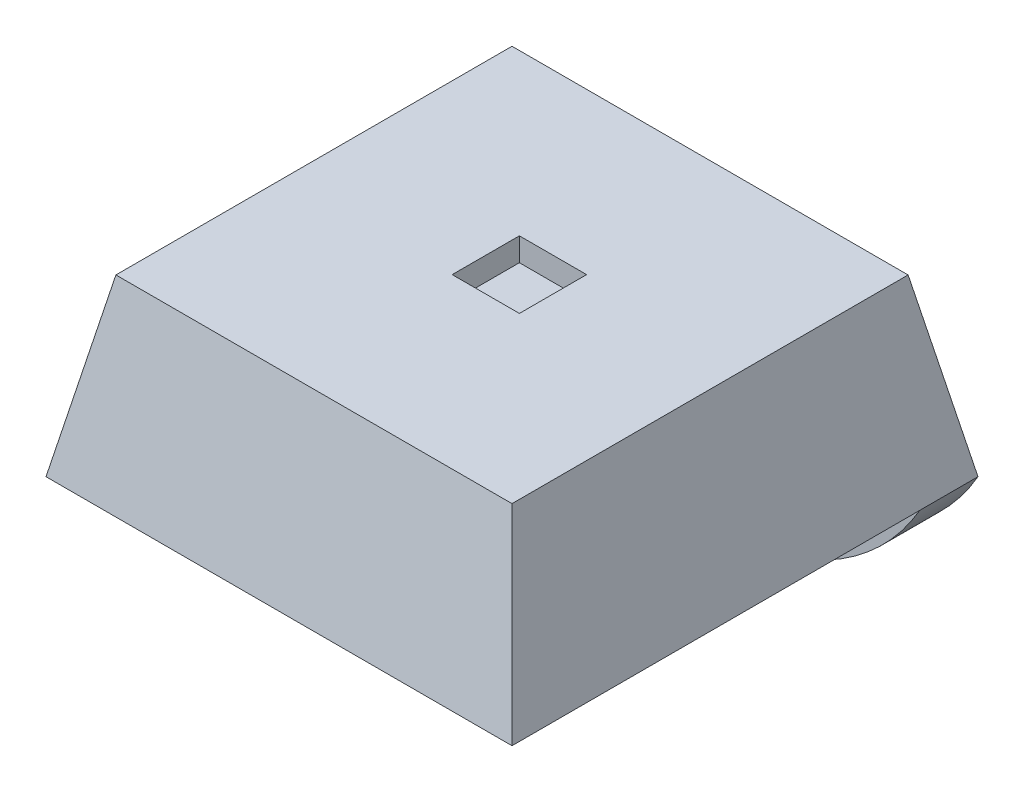
ISO-10303-21;
HEADER;
FILE_DESCRIPTION(('STEP AP214'),'2;1');
FILE_NAME('part.step','',(''),(''),'','','');
FILE_SCHEMA(('AUTOMOTIVE_DESIGN { 1 0 10303 214 1 1 1 1 }'));
ENDSEC;
DATA;
#1=APPLICATION_CONTEXT('core data for automotive mechanical design processes');
#2=APPLICATION_PROTOCOL_DEFINITION('international standard','automotive_design',2000,#1);
#3=PRODUCT_CONTEXT('',#1,'mechanical');
#4=PRODUCT('Part','Part','',(#3));
#5=PRODUCT_RELATED_PRODUCT_CATEGORY('part','',(#4));
#6=PRODUCT_DEFINITION_FORMATION('','',#4);
#7=PRODUCT_DEFINITION_CONTEXT('part definition',#1,'design');
#8=PRODUCT_DEFINITION('design','',#6,#7);
#9=PRODUCT_DEFINITION_SHAPE('','',#8);
#10=(LENGTH_UNIT() NAMED_UNIT(*) SI_UNIT(.MILLI.,.METRE.));
#11=(NAMED_UNIT(*) PLANE_ANGLE_UNIT() SI_UNIT($,.RADIAN.));
#12=(NAMED_UNIT(*) SI_UNIT($,.STERADIAN.) SOLID_ANGLE_UNIT());
#13=UNCERTAINTY_MEASURE_WITH_UNIT(LENGTH_MEASURE(1.E-05),#10,'distance_accuracy_value','');
#14=(GEOMETRIC_REPRESENTATION_CONTEXT(3) GLOBAL_UNCERTAINTY_ASSIGNED_CONTEXT((#13)) GLOBAL_UNIT_ASSIGNED_CONTEXT((#10,
#11,#12)) REPRESENTATION_CONTEXT('',''));
#15=CARTESIAN_POINT('',(0.,0.,0.));
#16=DIRECTION('',(0.,0.,1.));
#17=DIRECTION('',(1.,0.,0.));
#18=AXIS2_PLACEMENT_3D('',#15,#16,#17);
#19=CARTESIAN_POINT('',(0.,3.,0.));
#20=DIRECTION('',(0.,-1.,0.));
#21=DIRECTION('',(0.,0.,-1.));
#22=AXIS2_PLACEMENT_3D('',#19,#20,#21);
#23=PLANE('',#22);
#24=DIRECTION('',(-1.,0.,0.));
#25=VECTOR('',#24,1.);
#26=CARTESIAN_POINT('',(11.,3.,-0.6));
#27=LINE('',#26,#25);
#28=CARTESIAN_POINT('',(7.4,3.,-0.6));
#29=VERTEX_POINT('',#28);
#30=CARTESIAN_POINT('',(0.6,3.,-0.6));
#31=VERTEX_POINT('',#30);
#32=EDGE_CURVE('E181',#29,#31,#27,.T.);
#33=ORIENTED_EDGE('',*,*,#32,.F.);
#34=DIRECTION('',(0.,0.,1.));
#35=VECTOR('',#34,1.);
#36=CARTESIAN_POINT('',(7.4,3.,-8.));
#37=LINE('',#36,#35);
#38=CARTESIAN_POINT('',(7.4,3.,-7.4));
#39=VERTEX_POINT('',#38);
#40=EDGE_CURVE('E194',#39,#29,#37,.T.);
#41=ORIENTED_EDGE('',*,*,#40,.F.);
#42=DIRECTION('',(-1.,0.,0.));
#43=VECTOR('',#42,1.);
#44=CARTESIAN_POINT('',(11.,3.,-7.4));
#45=LINE('',#44,#43);
#46=CARTESIAN_POINT('',(0.599999999999999,3.,-7.4));
#47=VERTEX_POINT('',#46);
#48=EDGE_CURVE('E177',#39,#47,#45,.T.);
#49=ORIENTED_EDGE('',*,*,#48,.T.);
#50=DIRECTION('',(0.,0.,1.));
#51=VECTOR('',#50,1.);
#52=CARTESIAN_POINT('',(0.6,3.,-8.));
#53=LINE('',#52,#51);
#54=EDGE_CURVE('E197',#47,#31,#53,.T.);
#55=ORIENTED_EDGE('',*,*,#54,.T.);
#56=EDGE_LOOP('',(#33,#41,#49,#55));
#57=FACE_BOUND('',#56,.T.);
#58=DIRECTION('',(-1.,0.,0.));
#59=VECTOR('',#58,1.);
#60=CARTESIAN_POINT('',(4.63573241470774,3.,-3.49105487143866));
#61=LINE('',#60,#59);
#62=CARTESIAN_POINT('',(4.63573241470774,3.,-3.49105487143866));
#63=VERTEX_POINT('',#62);
#64=CARTESIAN_POINT('',(3.48188626086159,3.,-3.49105487143866));
#65=VERTEX_POINT('',#64);
#66=EDGE_CURVE('E59',#63,#65,#61,.T.);
#67=ORIENTED_EDGE('',*,*,#66,.T.);
#68=DIRECTION('',(0.,0.,-1.));
#69=VECTOR('',#68,1.);
#70=CARTESIAN_POINT('',(3.48188626086159,3.,-3.49105487143866));
#71=LINE('',#70,#69);
#72=CARTESIAN_POINT('',(3.48188626086159,3.,-4.64490102528481));
#73=VERTEX_POINT('',#72);
#74=EDGE_CURVE('E149',#65,#73,#71,.T.);
#75=ORIENTED_EDGE('',*,*,#74,.T.);
#76=DIRECTION('',(1.,0.,0.));
#77=VECTOR('',#76,1.);
#78=CARTESIAN_POINT('',(3.48188626086159,3.,-4.64490102528481));
#79=LINE('',#78,#77);
#80=CARTESIAN_POINT('',(4.63573241470774,3.,-4.64490102528481));
#81=VERTEX_POINT('',#80);
#82=EDGE_CURVE('E476',#73,#81,#79,.T.);
#83=ORIENTED_EDGE('',*,*,#82,.T.);
#84=DIRECTION('',(0.,0.,1.));
#85=VECTOR('',#84,1.);
#86=CARTESIAN_POINT('',(4.63573241470774,3.,-4.64490102528481));
#87=LINE('',#86,#85);
#88=EDGE_CURVE('E145',#81,#63,#87,.T.);
#89=ORIENTED_EDGE('',*,*,#88,.T.);
#90=EDGE_LOOP('',(#67,#75,#83,#89));
#91=FACE_BOUND('',#90,.T.);
#92=ADVANCED_FACE('F43',(#57,#91),#23,.F.);
#93=CARTESIAN_POINT('',(8.,0.,-8.));
#94=DIRECTION('',(-0.98058067569092,-0.196116135138184,0.));
#95=DIRECTION('',(0.196116135138184,-0.98058067569092,0.));
#96=AXIS2_PLACEMENT_3D('',#93,#94,#95);
#97=PLANE('',#96);
#98=DIRECTION('',(-0.192450089729875,0.962250448649376,-0.192450089729875));
#99=VECTOR('',#98,1.);
#100=CARTESIAN_POINT('',(7.7037037037037,1.48148148148148,-0.296296296296296));
#101=LINE('',#100,#99);
#102=CARTESIAN_POINT('',(8.,0.,0.));
#103=VERTEX_POINT('',#102);
#104=EDGE_CURVE('E191',#103,#29,#101,.T.);
#105=ORIENTED_EDGE('',*,*,#104,.F.);
#106=DIRECTION('',(0.,0.,-1.));
#107=VECTOR('',#106,1.);
#108=CARTESIAN_POINT('',(8.,0.,0.));
#109=LINE('',#108,#107);
#110=CARTESIAN_POINT('',(8.,0.,-7.));
#111=VERTEX_POINT('',#110);
#112=EDGE_CURVE('E210',#103,#111,#109,.T.);
#113=ORIENTED_EDGE('',*,*,#112,.T.);
#114=DIRECTION('',(0.,0.,1.));
#115=VECTOR('',#114,1.);
#116=CARTESIAN_POINT('',(8.,0.,-8.));
#117=LINE('',#116,#115);
#118=CARTESIAN_POINT('',(8.,0.,-8.));
#119=VERTEX_POINT('',#118);
#120=EDGE_CURVE('E151',#119,#111,#117,.T.);
#121=ORIENTED_EDGE('',*,*,#120,.F.);
#122=DIRECTION('',(0.192450089729875,-0.962250448649376,-0.192450089729875));
#123=VECTOR('',#122,1.);
#124=CARTESIAN_POINT('',(8.,0.,-8.));
#125=LINE('',#124,#123);
#126=EDGE_CURVE('E184',#39,#119,#125,.T.);
#127=ORIENTED_EDGE('',*,*,#126,.F.);
#128=ORIENTED_EDGE('',*,*,#40,.T.);
#129=EDGE_LOOP('',(#105,#113,#121,#127,#128));
#130=FACE_BOUND('',#129,.T.);
#131=ADVANCED_FACE('F278',(#130),#97,.F.);
#132=CARTESIAN_POINT('',(0.,0.,-8.));
#133=DIRECTION('',(0.98058067569092,-0.196116135138184,0.));
#134=DIRECTION('',(0.196116135138184,0.98058067569092,0.));
#135=AXIS2_PLACEMENT_3D('',#132,#133,#134);
#136=PLANE('',#135);
#137=DIRECTION('',(-0.192450089729875,-0.962250448649376,0.192450089729875));
#138=VECTOR('',#137,1.);
#139=CARTESIAN_POINT('',(0.296296296296296,1.48148148148148,-0.296296296296296));
#140=LINE('',#139,#138);
#141=CARTESIAN_POINT('',(0.,0.,0.));
#142=VERTEX_POINT('',#141);
#143=EDGE_CURVE('E238',#31,#142,#140,.T.);
#144=ORIENTED_EDGE('',*,*,#143,.F.);
#145=ORIENTED_EDGE('',*,*,#54,.F.);
#146=DIRECTION('',(0.192450089729875,0.962250448649376,0.192450089729875));
#147=VECTOR('',#146,1.);
#148=CARTESIAN_POINT('',(0.,0.,-8.));
#149=LINE('',#148,#147);
#150=CARTESIAN_POINT('',(0.,0.,-8.));
#151=VERTEX_POINT('',#150);
#152=EDGE_CURVE('E209',#151,#47,#149,.T.);
#153=ORIENTED_EDGE('',*,*,#152,.F.);
#154=DIRECTION('',(0.,0.,1.));
#155=VECTOR('',#154,1.);
#156=CARTESIAN_POINT('',(0.,0.,0.));
#157=LINE('',#156,#155);
#158=CARTESIAN_POINT('',(0.,0.,-7.));
#159=VERTEX_POINT('',#158);
#160=EDGE_CURVE('E214',#151,#159,#157,.T.);
#161=ORIENTED_EDGE('',*,*,#160,.T.);
#162=EDGE_CURVE('E201',#159,#142,#157,.T.);
#163=ORIENTED_EDGE('',*,*,#162,.T.);
#164=EDGE_LOOP('',(#144,#145,#153,#161,#163));
#165=FACE_BOUND('',#164,.T.);
#166=ADVANCED_FACE('F262',(#165),#136,.F.);
#167=CARTESIAN_POINT('',(0.,0.,0.));
#168=DIRECTION('',(0.,-1.,0.));
#169=DIRECTION('',(0.,0.,-1.));
#170=AXIS2_PLACEMENT_3D('',#167,#168,#169);
#171=PLANE('',#170);
#172=DIRECTION('',(-1.,0.,0.));
#173=VECTOR('',#172,1.);
#174=CARTESIAN_POINT('',(0.,0.,-7.));
#175=LINE('',#174,#173);
#176=EDGE_CURVE('E157',#111,#159,#175,.T.);
#177=ORIENTED_EDGE('',*,*,#176,.F.);
#178=ORIENTED_EDGE('',*,*,#112,.F.);
#179=DIRECTION('',(1.,0.,0.));
#180=VECTOR('',#179,1.);
#181=CARTESIAN_POINT('',(0.,0.,0.));
#182=LINE('',#181,#180);
#183=EDGE_CURVE('E211',#142,#103,#182,.T.);
#184=ORIENTED_EDGE('',*,*,#183,.F.);
#185=ORIENTED_EDGE('',*,*,#162,.F.);
#186=EDGE_LOOP('',(#177,#178,#184,#185));
#187=FACE_BOUND('',#186,.T.);
#188=CARTESIAN_POINT('',(4.,0.,-3.75));
#189=DIRECTION('',(0.,-1.,0.));
#190=DIRECTION('',(0.,0.,-1.));
#191=AXIS2_PLACEMENT_3D('',#188,#189,#190);
#192=CIRCLE('',#191,1.75);
#193=CARTESIAN_POINT('',(4.,0.,-5.5));
#194=VERTEX_POINT('',#193);
#195=EDGE_CURVE('E169',#194,#194,#192,.T.);
#196=ORIENTED_EDGE('',*,*,#195,.F.);
#197=EDGE_LOOP('',(#196));
#198=FACE_BOUND('',#197,.T.);
#199=ADVANCED_FACE('F273',(#187,#198),#171,.T.);
#200=CARTESIAN_POINT('',(11.,3.,-7.4));
#201=DIRECTION('',(0.,0.196116135138184,-0.98058067569092));
#202=DIRECTION('',(0.,0.98058067569092,0.196116135138184));
#203=AXIS2_PLACEMENT_3D('',#200,#201,#202);
#204=PLANE('',#203);
#205=ORIENTED_EDGE('',*,*,#126,.T.);
#206=DIRECTION('',(-1.,0.,0.));
#207=VECTOR('',#206,1.);
#208=CARTESIAN_POINT('',(0.,0.,-8.));
#209=LINE('',#208,#207);
#210=EDGE_CURVE('E205',#119,#151,#209,.T.);
#211=ORIENTED_EDGE('',*,*,#210,.T.);
#212=ORIENTED_EDGE('',*,*,#152,.T.);
#213=ORIENTED_EDGE('',*,*,#48,.F.);
#214=EDGE_LOOP('',(#205,#211,#212,#213));
#215=FACE_BOUND('',#214,.T.);
#216=ADVANCED_FACE('F257',(#215),#204,.T.);
#217=CARTESIAN_POINT('',(11.,0.,0.));
#218=DIRECTION('',(0.,0.196116135138184,0.98058067569092));
#219=DIRECTION('',(0.,-0.98058067569092,0.196116135138184));
#220=AXIS2_PLACEMENT_3D('',#217,#218,#219);
#221=PLANE('',#220);
#222=ORIENTED_EDGE('',*,*,#104,.T.);
#223=ORIENTED_EDGE('',*,*,#32,.T.);
#224=ORIENTED_EDGE('',*,*,#143,.T.);
#225=ORIENTED_EDGE('',*,*,#183,.T.);
#226=EDGE_LOOP('',(#222,#223,#224,#225));
#227=FACE_BOUND('',#226,.T.);
#228=ADVANCED_FACE('F302',(#227),#221,.T.);
#229=CARTESIAN_POINT('',(4.,0.4,-3.75));
#230=DIRECTION('',(0.,-1.,0.));
#231=DIRECTION('',(0.,0.,-1.));
#232=AXIS2_PLACEMENT_3D('',#229,#230,#231);
#233=CYLINDRICAL_SURFACE('',#232,1.75);
#234=CARTESIAN_POINT('',(4.,0.4,-3.75));
#235=DIRECTION('',(0.,-1.,0.));
#236=DIRECTION('',(0.,0.,-1.));
#237=AXIS2_PLACEMENT_3D('',#234,#235,#236);
#238=CIRCLE('',#237,1.75);
#239=CARTESIAN_POINT('',(4.,0.4,-5.5));
#240=VERTEX_POINT('',#239);
#241=EDGE_CURVE('E173',#240,#240,#238,.T.);
#242=ORIENTED_EDGE('',*,*,#241,.F.);
#243=EDGE_LOOP('',(#242));
#244=FACE_BOUND('',#243,.T.);
#245=ORIENTED_EDGE('',*,*,#195,.T.);
#246=EDGE_LOOP('',(#245));
#247=FACE_BOUND('',#246,.T.);
#248=ADVANCED_FACE('F309',(#244,#247),#233,.F.);
#249=CARTESIAN_POINT('',(4.,0.4,-3.75));
#250=DIRECTION('',(0.,-1.,0.));
#251=DIRECTION('',(0.,0.,-1.));
#252=AXIS2_PLACEMENT_3D('',#249,#250,#251);
#253=PLANE('',#252);
#254=ORIENTED_EDGE('',*,*,#241,.T.);
#255=EDGE_LOOP('',(#254));
#256=FACE_BOUND('',#255,.T.);
#257=ADVANCED_FACE('F313',(#256),#253,.T.);
#258=CARTESIAN_POINT('',(0.,-2.,-8.));
#259=DIRECTION('',(0.,0.,1.));
#260=DIRECTION('',(1.,0.,0.));
#261=AXIS2_PLACEMENT_3D('',#258,#259,#260);
#262=PLANE('',#261);
#263=ORIENTED_EDGE('',*,*,#210,.F.);
#264=CARTESIAN_POINT('',(4.53589838486225,2.,-8.));
#265=DIRECTION('',(0.,0.,1.));
#266=DIRECTION('',(1.,0.,0.));
#267=AXIS2_PLACEMENT_3D('',#264,#265,#266);
#268=CIRCLE('',#267,4.);
#269=CARTESIAN_POINT('',(4.53589838486225,-2.,-8.));
#270=VERTEX_POINT('',#269);
#271=EDGE_CURVE('E11',#119,#270,#268,.F.);
#272=ORIENTED_EDGE('',*,*,#271,.T.);
#273=DIRECTION('',(1.,0.,0.));
#274=VECTOR('',#273,1.);
#275=CARTESIAN_POINT('',(0.,-2.,-8.));
#276=LINE('',#275,#274);
#277=CARTESIAN_POINT('',(3.46410161513775,-2.,-8.));
#278=VERTEX_POINT('',#277);
#279=EDGE_CURVE('E163',#278,#270,#276,.T.);
#280=ORIENTED_EDGE('',*,*,#279,.F.);
#281=CARTESIAN_POINT('',(3.46410161513775,2.,-8.));
#282=DIRECTION('',(0.,0.,1.));
#283=DIRECTION('',(1.,0.,0.));
#284=AXIS2_PLACEMENT_3D('',#281,#282,#283);
#285=CIRCLE('',#284,4.);
#286=EDGE_CURVE('E52',#278,#151,#285,.F.);
#287=ORIENTED_EDGE('',*,*,#286,.T.);
#288=EDGE_LOOP('',(#263,#272,#280,#287));
#289=FACE_BOUND('',#288,.T.);
#290=ADVANCED_FACE('F250',(#289),#262,.F.);
#291=CARTESIAN_POINT('',(0.,-2.,-7.));
#292=DIRECTION('',(0.,0.,-1.));
#293=DIRECTION('',(-1.,0.,0.));
#294=AXIS2_PLACEMENT_3D('',#291,#292,#293);
#295=PLANE('',#294);
#296=DIRECTION('',(-1.,0.,0.));
#297=VECTOR('',#296,1.);
#298=CARTESIAN_POINT('',(0.,-2.,-7.));
#299=LINE('',#298,#297);
#300=CARTESIAN_POINT('',(4.53589838486225,-2.,-7.));
#301=VERTEX_POINT('',#300);
#302=CARTESIAN_POINT('',(3.46410161513775,-2.,-7.));
#303=VERTEX_POINT('',#302);
#304=EDGE_CURVE('E167',#301,#303,#299,.T.);
#305=ORIENTED_EDGE('',*,*,#304,.F.);
#306=CARTESIAN_POINT('',(4.53589838486225,2.,-7.));
#307=DIRECTION('',(0.,0.,-1.));
#308=DIRECTION('',(-1.,0.,0.));
#309=AXIS2_PLACEMENT_3D('',#306,#307,#308);
#310=CIRCLE('',#309,4.);
#311=EDGE_CURVE('E244',#301,#111,#310,.F.);
#312=ORIENTED_EDGE('',*,*,#311,.T.);
#313=ORIENTED_EDGE('',*,*,#176,.T.);
#314=CARTESIAN_POINT('',(3.46410161513775,2.,-7.));
#315=DIRECTION('',(0.,0.,-1.));
#316=DIRECTION('',(-1.,0.,0.));
#317=AXIS2_PLACEMENT_3D('',#314,#315,#316);
#318=CIRCLE('',#317,4.);
#319=EDGE_CURVE('E67',#159,#303,#318,.F.);
#320=ORIENTED_EDGE('',*,*,#319,.T.);
#321=EDGE_LOOP('',(#305,#312,#313,#320));
#322=FACE_BOUND('',#321,.T.);
#323=ADVANCED_FACE('F268',(#322),#295,.F.);
#324=CARTESIAN_POINT('',(0.,-2.,0.));
#325=DIRECTION('',(0.,1.,0.));
#326=DIRECTION('',(0.,0.,1.));
#327=AXIS2_PLACEMENT_3D('',#324,#325,#326);
#328=PLANE('',#327);
#329=ORIENTED_EDGE('',*,*,#279,.T.);
#330=DIRECTION('',(0.,0.,1.));
#331=VECTOR('',#330,1.);
#332=CARTESIAN_POINT('',(4.53589838486225,-2.,0.));
#333=LINE('',#332,#331);
#334=EDGE_CURVE('E237',#270,#301,#333,.T.);
#335=ORIENTED_EDGE('',*,*,#334,.T.);
#336=ORIENTED_EDGE('',*,*,#304,.T.);
#337=DIRECTION('',(0.,0.,-1.));
#338=VECTOR('',#337,1.);
#339=CARTESIAN_POINT('',(3.46410161513775,-2.,0.));
#340=LINE('',#339,#338);
#341=EDGE_CURVE('E233',#303,#278,#340,.T.);
#342=ORIENTED_EDGE('',*,*,#341,.T.);
#343=EDGE_LOOP('',(#329,#335,#336,#342));
#344=FACE_BOUND('',#343,.T.);
#345=ADVANCED_FACE('F266',(#344),#328,.F.);
#346=CARTESIAN_POINT('',(4.53589838486225,2.,-8.));
#347=DIRECTION('',(0.,0.,1.));
#348=DIRECTION('',(1.,0.,0.));
#349=AXIS2_PLACEMENT_3D('',#346,#347,#348);
#350=CYLINDRICAL_SURFACE('',#349,4.);
#351=ORIENTED_EDGE('',*,*,#271,.F.);
#352=ORIENTED_EDGE('',*,*,#120,.T.);
#353=ORIENTED_EDGE('',*,*,#311,.F.);
#354=ORIENTED_EDGE('',*,*,#334,.F.);
#355=EDGE_LOOP('',(#351,#352,#353,#354));
#356=FACE_BOUND('',#355,.T.);
#357=ADVANCED_FACE('F279',(#356),#350,.T.);
#358=CARTESIAN_POINT('',(3.46410161513775,2.,-8.));
#359=DIRECTION('',(0.,0.,-1.));
#360=DIRECTION('',(-1.,0.,0.));
#361=AXIS2_PLACEMENT_3D('',#358,#359,#360);
#362=CYLINDRICAL_SURFACE('',#361,4.);
#363=ORIENTED_EDGE('',*,*,#319,.F.);
#364=ORIENTED_EDGE('',*,*,#160,.F.);
#365=ORIENTED_EDGE('',*,*,#286,.F.);
#366=ORIENTED_EDGE('',*,*,#341,.F.);
#367=EDGE_LOOP('',(#363,#364,#365,#366));
#368=FACE_BOUND('',#367,.T.);
#369=ADVANCED_FACE('F45',(#368),#362,.T.);
#370=CARTESIAN_POINT('',(4.63573241470774,2.6,-3.49105487143866));
#371=DIRECTION('',(0.,0.,-1.));
#372=DIRECTION('',(-1.,0.,0.));
#373=AXIS2_PLACEMENT_3D('',#370,#371,#372);
#374=PLANE('',#373);
#375=ORIENTED_EDGE('',*,*,#66,.F.);
#376=DIRECTION('',(0.,1.,0.));
#377=VECTOR('',#376,1.);
#378=CARTESIAN_POINT('',(4.63573241470774,2.6,-3.49105487143866));
#379=LINE('',#378,#377);
#380=CARTESIAN_POINT('',(4.63573241470774,2.6,-3.49105487143866));
#381=VERTEX_POINT('',#380);
#382=EDGE_CURVE('E143',#381,#63,#379,.T.);
#383=ORIENTED_EDGE('',*,*,#382,.F.);
#384=DIRECTION('',(-1.,0.,0.));
#385=VECTOR('',#384,1.);
#386=CARTESIAN_POINT('',(4.63573241470774,2.6,-3.49105487143866));
#387=LINE('',#386,#385);
#388=CARTESIAN_POINT('',(3.48188626086159,2.6,-3.49105487143866));
#389=VERTEX_POINT('',#388);
#390=EDGE_CURVE('E134',#381,#389,#387,.T.);
#391=ORIENTED_EDGE('',*,*,#390,.T.);
#392=DIRECTION('',(0.,1.,0.));
#393=VECTOR('',#392,1.);
#394=CARTESIAN_POINT('',(3.48188626086159,2.6,-3.49105487143866));
#395=LINE('',#394,#393);
#396=EDGE_CURVE('E142',#389,#65,#395,.T.);
#397=ORIENTED_EDGE('',*,*,#396,.T.);
#398=EDGE_LOOP('',(#375,#383,#391,#397));
#399=FACE_BOUND('',#398,.T.);
#400=ADVANCED_FACE('F141',(#399),#374,.T.);
#401=CARTESIAN_POINT('',(3.48188626086159,2.6,-3.49105487143866));
#402=DIRECTION('',(1.,0.,0.));
#403=DIRECTION('',(0.,0.,-1.));
#404=AXIS2_PLACEMENT_3D('',#401,#402,#403);
#405=PLANE('',#404);
#406=ORIENTED_EDGE('',*,*,#74,.F.);
#407=ORIENTED_EDGE('',*,*,#396,.F.);
#408=DIRECTION('',(0.,0.,-1.));
#409=VECTOR('',#408,1.);
#410=CARTESIAN_POINT('',(3.48188626086159,2.6,-3.49105487143866));
#411=LINE('',#410,#409);
#412=CARTESIAN_POINT('',(3.48188626086159,2.6,-4.64490102528481));
#413=VERTEX_POINT('',#412);
#414=EDGE_CURVE('E130',#389,#413,#411,.T.);
#415=ORIENTED_EDGE('',*,*,#414,.T.);
#416=DIRECTION('',(0.,1.,0.));
#417=VECTOR('',#416,1.);
#418=CARTESIAN_POINT('',(3.48188626086159,2.6,-4.64490102528481));
#419=LINE('',#418,#417);
#420=EDGE_CURVE('E152',#413,#73,#419,.T.);
#421=ORIENTED_EDGE('',*,*,#420,.T.);
#422=EDGE_LOOP('',(#406,#407,#415,#421));
#423=FACE_BOUND('',#422,.T.);
#424=ADVANCED_FACE('F147',(#423),#405,.T.);
#425=CARTESIAN_POINT('',(3.48188626086159,2.6,-4.64490102528481));
#426=DIRECTION('',(0.,0.,1.));
#427=DIRECTION('',(1.,0.,0.));
#428=AXIS2_PLACEMENT_3D('',#425,#426,#427);
#429=PLANE('',#428);
#430=ORIENTED_EDGE('',*,*,#82,.F.);
#431=ORIENTED_EDGE('',*,*,#420,.F.);
#432=DIRECTION('',(1.,0.,0.));
#433=VECTOR('',#432,1.);
#434=CARTESIAN_POINT('',(3.48188626086159,2.6,-4.64490102528481));
#435=LINE('',#434,#433);
#436=CARTESIAN_POINT('',(4.63573241470774,2.6,-4.64490102528481));
#437=VERTEX_POINT('',#436);
#438=EDGE_CURVE('E135',#413,#437,#435,.T.);
#439=ORIENTED_EDGE('',*,*,#438,.T.);
#440=DIRECTION('',(0.,1.,0.));
#441=VECTOR('',#440,1.);
#442=CARTESIAN_POINT('',(4.63573241470774,2.6,-4.64490102528481));
#443=LINE('',#442,#441);
#444=EDGE_CURVE('E159',#437,#81,#443,.T.);
#445=ORIENTED_EDGE('',*,*,#444,.T.);
#446=EDGE_LOOP('',(#430,#431,#439,#445));
#447=FACE_BOUND('',#446,.T.);
#448=ADVANCED_FACE('F326',(#447),#429,.T.);
#449=CARTESIAN_POINT('',(4.63573241470774,2.6,-4.64490102528481));
#450=DIRECTION('',(-1.,0.,0.));
#451=DIRECTION('',(0.,0.,1.));
#452=AXIS2_PLACEMENT_3D('',#449,#450,#451);
#453=PLANE('',#452);
#454=ORIENTED_EDGE('',*,*,#88,.F.);
#455=ORIENTED_EDGE('',*,*,#444,.F.);
#456=DIRECTION('',(0.,0.,1.));
#457=VECTOR('',#456,1.);
#458=CARTESIAN_POINT('',(4.63573241470774,2.6,-4.64490102528481));
#459=LINE('',#458,#457);
#460=EDGE_CURVE('E486',#437,#381,#459,.T.);
#461=ORIENTED_EDGE('',*,*,#460,.T.);
#462=ORIENTED_EDGE('',*,*,#382,.T.);
#463=EDGE_LOOP('',(#454,#455,#461,#462));
#464=FACE_BOUND('',#463,.T.);
#465=ADVANCED_FACE('F329',(#464),#453,.T.);
#466=CARTESIAN_POINT('',(0.,2.6,0.));
#467=DIRECTION('',(0.,-1.,0.));
#468=DIRECTION('',(0.,0.,-1.));
#469=AXIS2_PLACEMENT_3D('',#466,#467,#468);
#470=PLANE('',#469);
#471=ORIENTED_EDGE('',*,*,#390,.F.);
#472=ORIENTED_EDGE('',*,*,#460,.F.);
#473=ORIENTED_EDGE('',*,*,#438,.F.);
#474=ORIENTED_EDGE('',*,*,#414,.F.);
#475=EDGE_LOOP('',(#471,#472,#473,#474));
#476=FACE_BOUND('',#475,.T.);
#477=ADVANCED_FACE('F132',(#476),#470,.F.);
#478=CLOSED_SHELL('',(#92,#131,#166,#199,#216,#228,#248,#257,#290,#323,#345,#357,#369,#400,#424,
#448,#465,#477));
#479=MANIFOLD_SOLID_BREP('B2',#478);
#480=ADVANCED_BREP_SHAPE_REPRESENTATION('',(#18,#479),#14);
#481=SHAPE_DEFINITION_REPRESENTATION(#9,#480);
ENDSEC;
END-ISO-10303-21;
